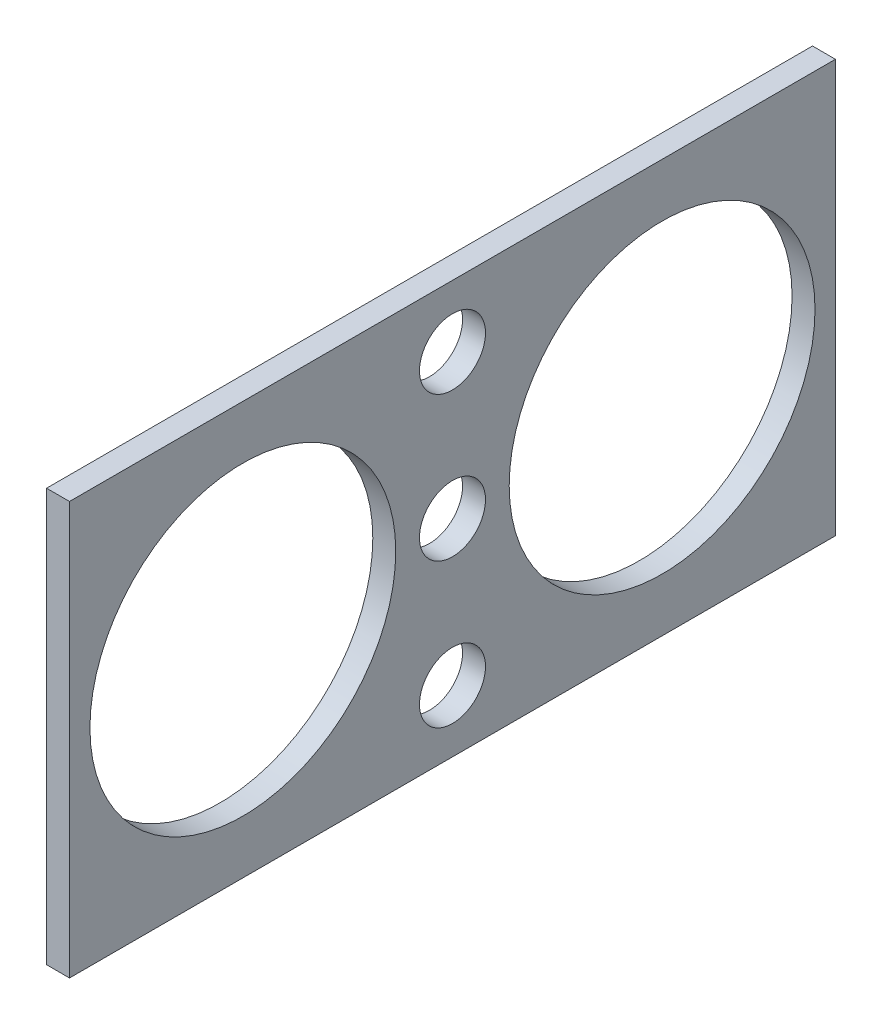
ISO-10303-21;
HEADER;
FILE_DESCRIPTION(('STEP AP214'),'2;1');
FILE_NAME('part.step','',(''),(''),'','','');
FILE_SCHEMA(('AUTOMOTIVE_DESIGN { 1 0 10303 214 1 1 1 1 }'));
ENDSEC;
DATA;
#1=APPLICATION_CONTEXT('core data for automotive mechanical design processes');
#2=APPLICATION_PROTOCOL_DEFINITION('international standard','automotive_design',2000,#1);
#3=PRODUCT_CONTEXT('',#1,'mechanical');
#4=PRODUCT('Part','Part','',(#3));
#5=PRODUCT_RELATED_PRODUCT_CATEGORY('part','',(#4));
#6=PRODUCT_DEFINITION_FORMATION('','',#4);
#7=PRODUCT_DEFINITION_CONTEXT('part definition',#1,'design');
#8=PRODUCT_DEFINITION('design','',#6,#7);
#9=PRODUCT_DEFINITION_SHAPE('','',#8);
#10=(LENGTH_UNIT() NAMED_UNIT(*) SI_UNIT(.MILLI.,.METRE.));
#11=(NAMED_UNIT(*) PLANE_ANGLE_UNIT() SI_UNIT($,.RADIAN.));
#12=(NAMED_UNIT(*) SI_UNIT($,.STERADIAN.) SOLID_ANGLE_UNIT());
#13=UNCERTAINTY_MEASURE_WITH_UNIT(LENGTH_MEASURE(1.E-05),#10,'distance_accuracy_value','');
#14=(GEOMETRIC_REPRESENTATION_CONTEXT(3) GLOBAL_UNCERTAINTY_ASSIGNED_CONTEXT((#13)) GLOBAL_UNIT_ASSIGNED_CONTEXT((#10,
#11,#12)) REPRESENTATION_CONTEXT('',''));
#15=CARTESIAN_POINT('',(0.,0.,0.));
#16=DIRECTION('',(0.,0.,1.));
#17=DIRECTION('',(1.,0.,0.));
#18=AXIS2_PLACEMENT_3D('',#15,#16,#17);
#19=CARTESIAN_POINT('',(-1.41224,25.4,0.));
#20=DIRECTION('',(0.,0.,1.));
#21=DIRECTION('',(0.,-1.,0.));
#22=AXIS2_PLACEMENT_3D('',#19,#20,#21);
#23=PLANE('',#22);
#24=DIRECTION('',(0.,-1.,0.));
#25=VECTOR('',#24,1.);
#26=CARTESIAN_POINT('',(0.,25.4,0.));
#27=LINE('',#26,#25);
#28=CARTESIAN_POINT('',(0.,25.4,0.));
#29=VERTEX_POINT('',#28);
#30=CARTESIAN_POINT('',(0.,0.,0.));
#31=VERTEX_POINT('',#30);
#32=EDGE_CURVE('E101',#29,#31,#27,.T.);
#33=ORIENTED_EDGE('',*,*,#32,.F.);
#34=DIRECTION('',(1.,0.,0.));
#35=VECTOR('',#34,1.);
#36=CARTESIAN_POINT('',(-1.41224,25.4,0.));
#37=LINE('',#36,#35);
#38=CARTESIAN_POINT('',(-1.41224,25.4,0.));
#39=VERTEX_POINT('',#38);
#40=EDGE_CURVE('E11',#39,#29,#37,.T.);
#41=ORIENTED_EDGE('',*,*,#40,.F.);
#42=DIRECTION('',(0.,-1.,0.));
#43=VECTOR('',#42,1.);
#44=CARTESIAN_POINT('',(-1.41224,25.4,0.));
#45=LINE('',#44,#43);
#46=CARTESIAN_POINT('',(-1.41224,0.,0.));
#47=VERTEX_POINT('',#46);
#48=EDGE_CURVE('E94',#39,#47,#45,.T.);
#49=ORIENTED_EDGE('',*,*,#48,.T.);
#50=DIRECTION('',(1.,0.,0.));
#51=VECTOR('',#50,1.);
#52=CARTESIAN_POINT('',(-1.41224,0.,0.));
#53=LINE('',#52,#51);
#54=EDGE_CURVE('E39',#47,#31,#53,.T.);
#55=ORIENTED_EDGE('',*,*,#54,.T.);
#56=EDGE_LOOP('',(#33,#41,#49,#55));
#57=FACE_BOUND('',#56,.T.);
#58=ADVANCED_FACE('F36',(#57),#23,.T.);
#59=CARTESIAN_POINT('',(-1.41224,25.4,-47.13986));
#60=DIRECTION('',(0.,1.,0.));
#61=DIRECTION('',(0.,0.,1.));
#62=AXIS2_PLACEMENT_3D('',#59,#60,#61);
#63=PLANE('',#62);
#64=DIRECTION('',(0.,0.,1.));
#65=VECTOR('',#64,1.);
#66=CARTESIAN_POINT('',(0.,25.4,-47.13986));
#67=LINE('',#66,#65);
#68=CARTESIAN_POINT('',(0.,25.4,-47.13986));
#69=VERTEX_POINT('',#68);
#70=EDGE_CURVE('E96',#69,#29,#67,.T.);
#71=ORIENTED_EDGE('',*,*,#70,.F.);
#72=DIRECTION('',(1.,0.,0.));
#73=VECTOR('',#72,1.);
#74=CARTESIAN_POINT('',(-1.41224,25.4,-47.13986));
#75=LINE('',#74,#73);
#76=CARTESIAN_POINT('',(-1.41224,25.4,-47.13986));
#77=VERTEX_POINT('',#76);
#78=EDGE_CURVE('E45',#77,#69,#75,.T.);
#79=ORIENTED_EDGE('',*,*,#78,.F.);
#80=DIRECTION('',(0.,0.,1.));
#81=VECTOR('',#80,1.);
#82=CARTESIAN_POINT('',(-1.41224,25.4,-47.13986));
#83=LINE('',#82,#81);
#84=EDGE_CURVE('E91',#77,#39,#83,.T.);
#85=ORIENTED_EDGE('',*,*,#84,.T.);
#86=ORIENTED_EDGE('',*,*,#40,.T.);
#87=EDGE_LOOP('',(#71,#79,#85,#86));
#88=FACE_BOUND('',#87,.T.);
#89=ADVANCED_FACE('F112',(#88),#63,.T.);
#90=CARTESIAN_POINT('',(-1.41224,0.,-47.13986));
#91=DIRECTION('',(0.,0.,-1.));
#92=DIRECTION('',(-1.,0.,0.));
#93=AXIS2_PLACEMENT_3D('',#90,#91,#92);
#94=PLANE('',#93);
#95=DIRECTION('',(0.,1.,0.));
#96=VECTOR('',#95,1.);
#97=CARTESIAN_POINT('',(0.,0.,-47.13986));
#98=LINE('',#97,#96);
#99=CARTESIAN_POINT('',(0.,0.,-47.13986));
#100=VERTEX_POINT('',#99);
#101=EDGE_CURVE('E86',#100,#69,#98,.T.);
#102=ORIENTED_EDGE('',*,*,#101,.F.);
#103=DIRECTION('',(1.,0.,0.));
#104=VECTOR('',#103,1.);
#105=CARTESIAN_POINT('',(-1.41224,0.,-47.13986));
#106=LINE('',#105,#104);
#107=CARTESIAN_POINT('',(-1.41224,0.,-47.13986));
#108=VERTEX_POINT('',#107);
#109=EDGE_CURVE('E81',#108,#100,#106,.T.);
#110=ORIENTED_EDGE('',*,*,#109,.F.);
#111=DIRECTION('',(0.,1.,0.));
#112=VECTOR('',#111,1.);
#113=CARTESIAN_POINT('',(-1.41224,0.,-47.13986));
#114=LINE('',#113,#112);
#115=EDGE_CURVE('E84',#108,#77,#114,.T.);
#116=ORIENTED_EDGE('',*,*,#115,.T.);
#117=ORIENTED_EDGE('',*,*,#78,.T.);
#118=EDGE_LOOP('',(#102,#110,#116,#117));
#119=FACE_BOUND('',#118,.T.);
#120=ADVANCED_FACE('F83',(#119),#94,.T.);
#121=CARTESIAN_POINT('',(-1.41224,0.,0.));
#122=DIRECTION('',(0.,-1.,0.));
#123=DIRECTION('',(0.,0.,-1.));
#124=AXIS2_PLACEMENT_3D('',#121,#122,#123);
#125=PLANE('',#124);
#126=DIRECTION('',(0.,0.,-1.));
#127=VECTOR('',#126,1.);
#128=CARTESIAN_POINT('',(0.,0.,0.));
#129=LINE('',#128,#127);
#130=EDGE_CURVE('E104',#31,#100,#129,.T.);
#131=ORIENTED_EDGE('',*,*,#130,.F.);
#132=ORIENTED_EDGE('',*,*,#54,.F.);
#133=DIRECTION('',(0.,0.,-1.));
#134=VECTOR('',#133,1.);
#135=CARTESIAN_POINT('',(-1.41224,0.,0.));
#136=LINE('',#135,#134);
#137=EDGE_CURVE('E90',#47,#108,#136,.T.);
#138=ORIENTED_EDGE('',*,*,#137,.T.);
#139=ORIENTED_EDGE('',*,*,#109,.T.);
#140=EDGE_LOOP('',(#131,#132,#138,#139));
#141=FACE_BOUND('',#140,.T.);
#142=ADVANCED_FACE('F93',(#141),#125,.T.);
#143=CARTESIAN_POINT('',(-1.41224,0.,0.));
#144=DIRECTION('',(1.,0.,0.));
#145=DIRECTION('',(0.,0.,-1.));
#146=AXIS2_PLACEMENT_3D('',#143,#144,#145);
#147=PLANE('',#146);
#148=CARTESIAN_POINT('',(-1.41224,12.7,-36.47186));
#149=DIRECTION('',(1.,0.,0.));
#150=DIRECTION('',(0.,0.,1.));
#151=AXIS2_PLACEMENT_3D('',#148,#149,#150);
#152=CIRCLE('',#151,9.41100889138097);
#153=CARTESIAN_POINT('',(-1.41224,12.7,-27.060851108619));
#154=VERTEX_POINT('',#153);
#155=EDGE_CURVE('E157',#154,#154,#152,.T.);
#156=ORIENTED_EDGE('',*,*,#155,.T.);
#157=EDGE_LOOP('',(#156));
#158=FACE_BOUND('',#157,.T.);
#159=CARTESIAN_POINT('',(-1.41224,12.7,-10.668));
#160=DIRECTION('',(1.,0.,0.));
#161=DIRECTION('',(0.,0.,-1.));
#162=AXIS2_PLACEMENT_3D('',#159,#160,#161);
#163=CIRCLE('',#162,9.41100889138097);
#164=CARTESIAN_POINT('',(-1.41224,12.7,-20.079008891381));
#165=VERTEX_POINT('',#164);
#166=EDGE_CURVE('E165',#165,#165,#163,.T.);
#167=ORIENTED_EDGE('',*,*,#166,.T.);
#168=EDGE_LOOP('',(#167));
#169=FACE_BOUND('',#168,.T.);
#170=CARTESIAN_POINT('',(-1.41224,3.81,-23.56993));
#171=DIRECTION('',(1.,0.,0.));
#172=DIRECTION('',(0.,0.,-1.));
#173=AXIS2_PLACEMENT_3D('',#170,#171,#172);
#174=CIRCLE('',#173,2.032);
#175=CARTESIAN_POINT('',(-1.41224,3.81,-25.60193));
#176=VERTEX_POINT('',#175);
#177=EDGE_CURVE('E171',#176,#176,#174,.T.);
#178=ORIENTED_EDGE('',*,*,#177,.T.);
#179=EDGE_LOOP('',(#178));
#180=FACE_BOUND('',#179,.T.);
#181=CARTESIAN_POINT('',(-1.41224,12.7,-23.56993));
#182=DIRECTION('',(1.,0.,0.));
#183=DIRECTION('',(0.,0.,-1.));
#184=AXIS2_PLACEMENT_3D('',#181,#182,#183);
#185=CIRCLE('',#184,2.032);
#186=CARTESIAN_POINT('',(-1.41224,12.7,-25.60193));
#187=VERTEX_POINT('',#186);
#188=EDGE_CURVE('E177',#187,#187,#185,.T.);
#189=ORIENTED_EDGE('',*,*,#188,.T.);
#190=EDGE_LOOP('',(#189));
#191=FACE_BOUND('',#190,.T.);
#192=CARTESIAN_POINT('',(-1.41224,21.59,-23.56993));
#193=DIRECTION('',(1.,0.,0.));
#194=DIRECTION('',(0.,0.,-1.));
#195=AXIS2_PLACEMENT_3D('',#192,#193,#194);
#196=CIRCLE('',#195,2.032);
#197=CARTESIAN_POINT('',(-1.41224,21.59,-25.60193));
#198=VERTEX_POINT('',#197);
#199=EDGE_CURVE('E105',#198,#198,#196,.T.);
#200=ORIENTED_EDGE('',*,*,#199,.T.);
#201=EDGE_LOOP('',(#200));
#202=FACE_BOUND('',#201,.T.);
#203=ORIENTED_EDGE('',*,*,#48,.F.);
#204=ORIENTED_EDGE('',*,*,#84,.F.);
#205=ORIENTED_EDGE('',*,*,#115,.F.);
#206=ORIENTED_EDGE('',*,*,#137,.F.);
#207=EDGE_LOOP('',(#203,#204,#205,#206));
#208=FACE_BOUND('',#207,.T.);
#209=ADVANCED_FACE('F89',(#158,#169,#180,#191,#202,#208),#147,.F.);
#210=CARTESIAN_POINT('',(0.,0.,0.));
#211=DIRECTION('',(1.,0.,0.));
#212=DIRECTION('',(0.,0.,-1.));
#213=AXIS2_PLACEMENT_3D('',#210,#211,#212);
#214=PLANE('',#213);
#215=CARTESIAN_POINT('',(0.,12.7,-36.47186));
#216=DIRECTION('',(1.,0.,0.));
#217=DIRECTION('',(0.,0.,1.));
#218=AXIS2_PLACEMENT_3D('',#215,#216,#217);
#219=CIRCLE('',#218,9.41100889138097);
#220=CARTESIAN_POINT('',(0.,12.7,-27.060851108619));
#221=VERTEX_POINT('',#220);
#222=EDGE_CURVE('E160',#221,#221,#219,.T.);
#223=ORIENTED_EDGE('',*,*,#222,.F.);
#224=EDGE_LOOP('',(#223));
#225=FACE_BOUND('',#224,.T.);
#226=CARTESIAN_POINT('',(0.,12.7,-10.668));
#227=DIRECTION('',(1.,0.,0.));
#228=DIRECTION('',(0.,0.,-1.));
#229=AXIS2_PLACEMENT_3D('',#226,#227,#228);
#230=CIRCLE('',#229,9.41100889138097);
#231=CARTESIAN_POINT('',(0.,12.7,-20.079008891381));
#232=VERTEX_POINT('',#231);
#233=EDGE_CURVE('E162',#232,#232,#230,.T.);
#234=ORIENTED_EDGE('',*,*,#233,.F.);
#235=EDGE_LOOP('',(#234));
#236=FACE_BOUND('',#235,.T.);
#237=CARTESIAN_POINT('',(0.,3.81,-23.56993));
#238=DIRECTION('',(1.,0.,0.));
#239=DIRECTION('',(0.,0.,-1.));
#240=AXIS2_PLACEMENT_3D('',#237,#238,#239);
#241=CIRCLE('',#240,2.032);
#242=CARTESIAN_POINT('',(0.,3.81,-25.60193));
#243=VERTEX_POINT('',#242);
#244=EDGE_CURVE('E168',#243,#243,#241,.T.);
#245=ORIENTED_EDGE('',*,*,#244,.F.);
#246=EDGE_LOOP('',(#245));
#247=FACE_BOUND('',#246,.T.);
#248=CARTESIAN_POINT('',(0.,12.7,-23.56993));
#249=DIRECTION('',(1.,0.,0.));
#250=DIRECTION('',(0.,0.,-1.));
#251=AXIS2_PLACEMENT_3D('',#248,#249,#250);
#252=CIRCLE('',#251,2.032);
#253=CARTESIAN_POINT('',(0.,12.7,-25.60193));
#254=VERTEX_POINT('',#253);
#255=EDGE_CURVE('E174',#254,#254,#252,.T.);
#256=ORIENTED_EDGE('',*,*,#255,.F.);
#257=EDGE_LOOP('',(#256));
#258=FACE_BOUND('',#257,.T.);
#259=CARTESIAN_POINT('',(0.,21.59,-23.56993));
#260=DIRECTION('',(1.,0.,0.));
#261=DIRECTION('',(0.,0.,-1.));
#262=AXIS2_PLACEMENT_3D('',#259,#260,#261);
#263=CIRCLE('',#262,2.032);
#264=CARTESIAN_POINT('',(0.,21.59,-25.60193));
#265=VERTEX_POINT('',#264);
#266=EDGE_CURVE('E180',#265,#265,#263,.T.);
#267=ORIENTED_EDGE('',*,*,#266,.F.);
#268=EDGE_LOOP('',(#267));
#269=FACE_BOUND('',#268,.T.);
#270=ORIENTED_EDGE('',*,*,#32,.T.);
#271=ORIENTED_EDGE('',*,*,#130,.T.);
#272=ORIENTED_EDGE('',*,*,#101,.T.);
#273=ORIENTED_EDGE('',*,*,#70,.T.);
#274=EDGE_LOOP('',(#270,#271,#272,#273));
#275=FACE_BOUND('',#274,.T.);
#276=ADVANCED_FACE('F111',(#225,#236,#247,#258,#269,#275),#214,.T.);
#277=CARTESIAN_POINT('',(-1.41224,21.59,-23.56993));
#278=DIRECTION('',(1.,0.,0.));
#279=DIRECTION('',(0.,0.,-1.));
#280=AXIS2_PLACEMENT_3D('',#277,#278,#279);
#281=CYLINDRICAL_SURFACE('',#280,2.032);
#282=ORIENTED_EDGE('',*,*,#199,.F.);
#283=EDGE_LOOP('',(#282));
#284=FACE_BOUND('',#283,.T.);
#285=ORIENTED_EDGE('',*,*,#266,.T.);
#286=EDGE_LOOP('',(#285));
#287=FACE_BOUND('',#286,.T.);
#288=ADVANCED_FACE('F130',(#284,#287),#281,.F.);
#289=CARTESIAN_POINT('',(-1.41224,12.7,-23.56993));
#290=DIRECTION('',(1.,0.,0.));
#291=DIRECTION('',(0.,0.,-1.));
#292=AXIS2_PLACEMENT_3D('',#289,#290,#291);
#293=CYLINDRICAL_SURFACE('',#292,2.032);
#294=ORIENTED_EDGE('',*,*,#188,.F.);
#295=EDGE_LOOP('',(#294));
#296=FACE_BOUND('',#295,.T.);
#297=ORIENTED_EDGE('',*,*,#255,.T.);
#298=EDGE_LOOP('',(#297));
#299=FACE_BOUND('',#298,.T.);
#300=ADVANCED_FACE('F137',(#296,#299),#293,.F.);
#301=CARTESIAN_POINT('',(-1.41224,3.81,-23.56993));
#302=DIRECTION('',(1.,0.,0.));
#303=DIRECTION('',(0.,0.,-1.));
#304=AXIS2_PLACEMENT_3D('',#301,#302,#303);
#305=CYLINDRICAL_SURFACE('',#304,2.032);
#306=ORIENTED_EDGE('',*,*,#177,.F.);
#307=EDGE_LOOP('',(#306));
#308=FACE_BOUND('',#307,.T.);
#309=ORIENTED_EDGE('',*,*,#244,.T.);
#310=EDGE_LOOP('',(#309));
#311=FACE_BOUND('',#310,.T.);
#312=ADVANCED_FACE('F141',(#308,#311),#305,.F.);
#313=CARTESIAN_POINT('',(-1.41224,12.7,-10.668));
#314=DIRECTION('',(1.,0.,0.));
#315=DIRECTION('',(0.,0.,-1.));
#316=AXIS2_PLACEMENT_3D('',#313,#314,#315);
#317=CYLINDRICAL_SURFACE('',#316,9.41100889138097);
#318=ORIENTED_EDGE('',*,*,#166,.F.);
#319=EDGE_LOOP('',(#318));
#320=FACE_BOUND('',#319,.T.);
#321=ORIENTED_EDGE('',*,*,#233,.T.);
#322=EDGE_LOOP('',(#321));
#323=FACE_BOUND('',#322,.T.);
#324=ADVANCED_FACE('F145',(#320,#323),#317,.F.);
#325=CARTESIAN_POINT('',(-1.41224,12.7,-36.47186));
#326=DIRECTION('',(1.,0.,0.));
#327=DIRECTION('',(0.,0.,-1.));
#328=AXIS2_PLACEMENT_3D('',#325,#326,#327);
#329=CYLINDRICAL_SURFACE('',#328,9.41100889138097);
#330=ORIENTED_EDGE('',*,*,#155,.F.);
#331=EDGE_LOOP('',(#330));
#332=FACE_BOUND('',#331,.T.);
#333=ORIENTED_EDGE('',*,*,#222,.T.);
#334=EDGE_LOOP('',(#333));
#335=FACE_BOUND('',#334,.T.);
#336=ADVANCED_FACE('F149',(#332,#335),#329,.F.);
#337=CLOSED_SHELL('',(#58,#89,#120,#142,#209,#276,#288,#300,#312,#324,#336));
#338=MANIFOLD_SOLID_BREP('B2',#337);
#339=ADVANCED_BREP_SHAPE_REPRESENTATION('',(#18,#338),#14);
#340=SHAPE_DEFINITION_REPRESENTATION(#9,#339);
ENDSEC;
END-ISO-10303-21;
